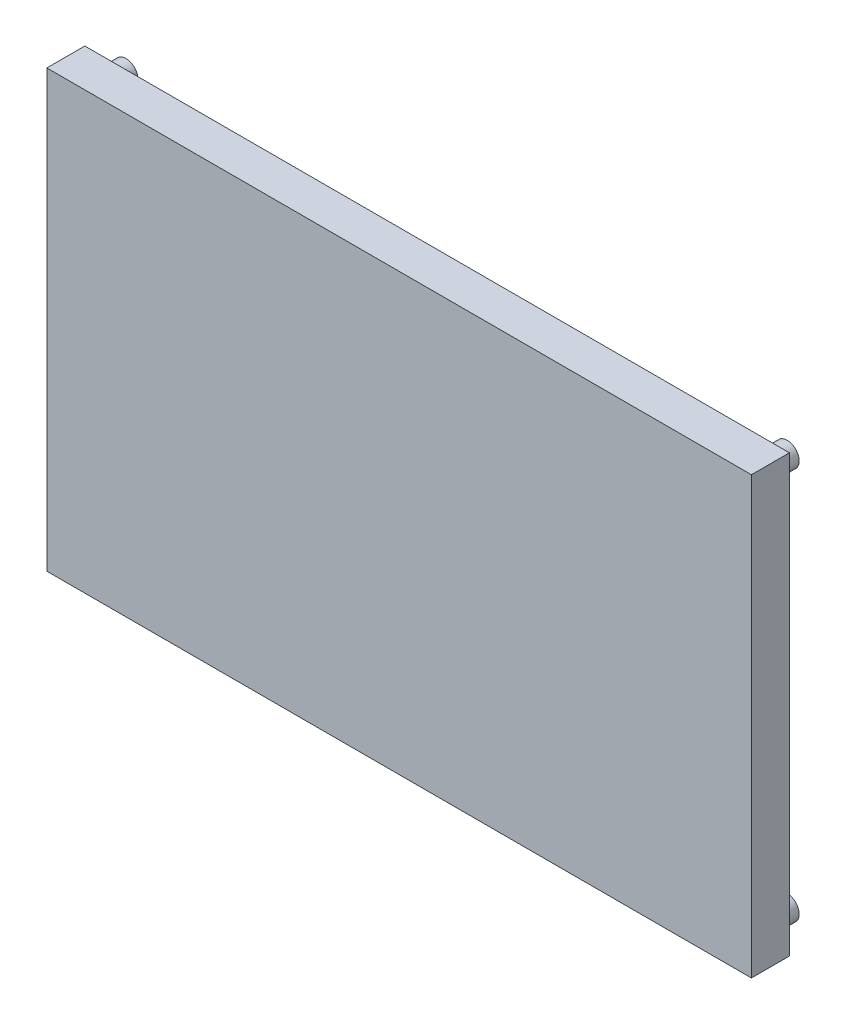
ISO-10303-21;
HEADER;
FILE_DESCRIPTION(('STEP AP214'),'2;1');
FILE_NAME('part.step','',(''),(''),'','','');
FILE_SCHEMA(('AUTOMOTIVE_DESIGN { 1 0 10303 214 1 1 1 1 }'));
ENDSEC;
DATA;
#1=APPLICATION_CONTEXT('core data for automotive mechanical design processes');
#2=APPLICATION_PROTOCOL_DEFINITION('international standard','automotive_design',2000,#1);
#3=PRODUCT_CONTEXT('',#1,'mechanical');
#4=PRODUCT('Part','Part','',(#3));
#5=PRODUCT_RELATED_PRODUCT_CATEGORY('part','',(#4));
#6=PRODUCT_DEFINITION_FORMATION('','',#4);
#7=PRODUCT_DEFINITION_CONTEXT('part definition',#1,'design');
#8=PRODUCT_DEFINITION('design','',#6,#7);
#9=PRODUCT_DEFINITION_SHAPE('','',#8);
#10=(LENGTH_UNIT() NAMED_UNIT(*) SI_UNIT(.MILLI.,.METRE.));
#11=(NAMED_UNIT(*) PLANE_ANGLE_UNIT() SI_UNIT($,.RADIAN.));
#12=(NAMED_UNIT(*) SI_UNIT($,.STERADIAN.) SOLID_ANGLE_UNIT());
#13=UNCERTAINTY_MEASURE_WITH_UNIT(LENGTH_MEASURE(1.E-05),#10,'distance_accuracy_value','');
#14=(GEOMETRIC_REPRESENTATION_CONTEXT(3) GLOBAL_UNCERTAINTY_ASSIGNED_CONTEXT((#13)) GLOBAL_UNIT_ASSIGNED_CONTEXT((#10,
#11,#12)) REPRESENTATION_CONTEXT('',''));
#15=CARTESIAN_POINT('',(0.,0.,0.));
#16=DIRECTION('',(0.,0.,1.));
#17=DIRECTION('',(1.,0.,0.));
#18=AXIS2_PLACEMENT_3D('',#15,#16,#17);
#19=CARTESIAN_POINT('',(-82.445,-51.,-8.89));
#20=DIRECTION('',(-1.,0.,0.));
#21=DIRECTION('',(0.,0.,1.));
#22=AXIS2_PLACEMENT_3D('',#19,#20,#21);
#23=PLANE('',#22);
#24=DIRECTION('',(0.,-1.,0.));
#25=VECTOR('',#24,1.);
#26=CARTESIAN_POINT('',(-82.445,-51.,0.));
#27=LINE('',#26,#25);
#28=CARTESIAN_POINT('',(-82.445,51.,0.));
#29=VERTEX_POINT('',#28);
#30=CARTESIAN_POINT('',(-82.445,-51.,0.));
#31=VERTEX_POINT('',#30);
#32=EDGE_CURVE('E119',#29,#31,#27,.T.);
#33=ORIENTED_EDGE('',*,*,#32,.F.);
#34=DIRECTION('',(0.,0.,1.));
#35=VECTOR('',#34,1.);
#36=CARTESIAN_POINT('',(-82.445,51.,-8.89));
#37=LINE('',#36,#35);
#38=CARTESIAN_POINT('',(-82.445,51.,-8.89));
#39=VERTEX_POINT('',#38);
#40=EDGE_CURVE('E62',#39,#29,#37,.T.);
#41=ORIENTED_EDGE('',*,*,#40,.F.);
#42=DIRECTION('',(0.,-1.,0.));
#43=VECTOR('',#42,1.);
#44=CARTESIAN_POINT('',(-82.445,-51.,-8.89));
#45=LINE('',#44,#43);
#46=CARTESIAN_POINT('',(-82.445,-51.,-8.89));
#47=VERTEX_POINT('',#46);
#48=EDGE_CURVE('E110',#39,#47,#45,.T.);
#49=ORIENTED_EDGE('',*,*,#48,.T.);
#50=DIRECTION('',(0.,0.,1.));
#51=VECTOR('',#50,1.);
#52=CARTESIAN_POINT('',(-82.445,-51.,-8.89));
#53=LINE('',#52,#51);
#54=EDGE_CURVE('E90',#47,#31,#53,.T.);
#55=ORIENTED_EDGE('',*,*,#54,.T.);
#56=EDGE_LOOP('',(#33,#41,#49,#55));
#57=FACE_BOUND('',#56,.T.);
#58=ADVANCED_FACE('F45',(#57),#23,.T.);
#59=CARTESIAN_POINT('',(82.445,51.,-8.89));
#60=DIRECTION('',(0.,1.,0.));
#61=DIRECTION('',(-1.,0.,0.));
#62=AXIS2_PLACEMENT_3D('',#59,#60,#61);
#63=PLANE('',#62);
#64=DIRECTION('',(-1.,0.,0.));
#65=VECTOR('',#64,1.);
#66=CARTESIAN_POINT('',(82.445,51.,0.));
#67=LINE('',#66,#65);
#68=CARTESIAN_POINT('',(82.445,51.,0.));
#69=VERTEX_POINT('',#68);
#70=EDGE_CURVE('E113',#69,#29,#67,.T.);
#71=ORIENTED_EDGE('',*,*,#70,.F.);
#72=DIRECTION('',(0.,0.,1.));
#73=VECTOR('',#72,1.);
#74=CARTESIAN_POINT('',(82.445,51.,-8.89));
#75=LINE('',#74,#73);
#76=CARTESIAN_POINT('',(82.445,51.,-8.89));
#77=VERTEX_POINT('',#76);
#78=EDGE_CURVE('E79',#77,#69,#75,.T.);
#79=ORIENTED_EDGE('',*,*,#78,.F.);
#80=DIRECTION('',(-1.,0.,0.));
#81=VECTOR('',#80,1.);
#82=CARTESIAN_POINT('',(82.445,51.,-8.89));
#83=LINE('',#82,#81);
#84=EDGE_CURVE('E105',#77,#39,#83,.T.);
#85=ORIENTED_EDGE('',*,*,#84,.T.);
#86=ORIENTED_EDGE('',*,*,#40,.T.);
#87=EDGE_LOOP('',(#71,#79,#85,#86));
#88=FACE_BOUND('',#87,.T.);
#89=ADVANCED_FACE('F200',(#88),#63,.T.);
#90=CARTESIAN_POINT('',(82.445,-51.,-8.89));
#91=DIRECTION('',(1.,0.,0.));
#92=DIRECTION('',(0.,0.,-1.));
#93=AXIS2_PLACEMENT_3D('',#90,#91,#92);
#94=PLANE('',#93);
#95=DIRECTION('',(0.,1.,0.));
#96=VECTOR('',#95,1.);
#97=CARTESIAN_POINT('',(82.445,-51.,0.));
#98=LINE('',#97,#96);
#99=CARTESIAN_POINT('',(82.445,-51.,0.));
#100=VERTEX_POINT('',#99);
#101=EDGE_CURVE('E98',#100,#69,#98,.T.);
#102=ORIENTED_EDGE('',*,*,#101,.F.);
#103=DIRECTION('',(0.,0.,1.));
#104=VECTOR('',#103,1.);
#105=CARTESIAN_POINT('',(82.445,-51.,-8.89));
#106=LINE('',#105,#104);
#107=CARTESIAN_POINT('',(82.445,-51.,-8.89));
#108=VERTEX_POINT('',#107);
#109=EDGE_CURVE('E93',#108,#100,#106,.T.);
#110=ORIENTED_EDGE('',*,*,#109,.F.);
#111=DIRECTION('',(0.,1.,0.));
#112=VECTOR('',#111,1.);
#113=CARTESIAN_POINT('',(82.445,-51.,-8.89));
#114=LINE('',#113,#112);
#115=EDGE_CURVE('E96',#108,#77,#114,.T.);
#116=ORIENTED_EDGE('',*,*,#115,.T.);
#117=ORIENTED_EDGE('',*,*,#78,.T.);
#118=EDGE_LOOP('',(#102,#110,#116,#117));
#119=FACE_BOUND('',#118,.T.);
#120=ADVANCED_FACE('F95',(#119),#94,.T.);
#121=CARTESIAN_POINT('',(82.445,-51.,-8.89));
#122=DIRECTION('',(0.,-1.,0.));
#123=DIRECTION('',(1.,0.,0.));
#124=AXIS2_PLACEMENT_3D('',#121,#122,#123);
#125=PLANE('',#124);
#126=DIRECTION('',(1.,0.,0.));
#127=VECTOR('',#126,1.);
#128=CARTESIAN_POINT('',(82.445,-51.,0.));
#129=LINE('',#128,#127);
#130=EDGE_CURVE('E123',#31,#100,#129,.T.);
#131=ORIENTED_EDGE('',*,*,#130,.F.);
#132=ORIENTED_EDGE('',*,*,#54,.F.);
#133=DIRECTION('',(1.,0.,0.));
#134=VECTOR('',#133,1.);
#135=CARTESIAN_POINT('',(82.445,-51.,-8.89));
#136=LINE('',#135,#134);
#137=EDGE_CURVE('E104',#47,#108,#136,.T.);
#138=ORIENTED_EDGE('',*,*,#137,.T.);
#139=ORIENTED_EDGE('',*,*,#109,.T.);
#140=EDGE_LOOP('',(#131,#132,#138,#139));
#141=FACE_BOUND('',#140,.T.);
#142=ADVANCED_FACE('F108',(#141),#125,.T.);
#143=CARTESIAN_POINT('',(0.,0.,-8.89));
#144=DIRECTION('',(0.,0.,1.));
#145=DIRECTION('',(1.,0.,0.));
#146=AXIS2_PLACEMENT_3D('',#143,#144,#145);
#147=PLANE('',#146);
#148=CARTESIAN_POINT('',(-23.351,15.78,-8.89));
#149=DIRECTION('',(0.,0.,1.));
#150=DIRECTION('',(1.,0.,0.));
#151=AXIS2_PLACEMENT_3D('',#148,#149,#150);
#152=CIRCLE('',#151,2.794);
#153=CARTESIAN_POINT('',(-20.557,15.78,-8.89));
#154=VERTEX_POINT('',#153);
#155=EDGE_CURVE('E11',#154,#154,#152,.F.);
#156=ORIENTED_EDGE('',*,*,#155,.F.);
#157=EDGE_LOOP('',(#156));
#158=FACE_BOUND('',#157,.T.);
#159=CARTESIAN_POINT('',(-23.351,-33.22,-8.89));
#160=DIRECTION('',(0.,0.,1.));
#161=DIRECTION('',(1.,0.,0.));
#162=AXIS2_PLACEMENT_3D('',#159,#160,#161);
#163=CIRCLE('',#162,2.794);
#164=CARTESIAN_POINT('',(-20.557,-33.22,-8.89));
#165=VERTEX_POINT('',#164);
#166=EDGE_CURVE('E54',#165,#165,#163,.F.);
#167=ORIENTED_EDGE('',*,*,#166,.F.);
#168=EDGE_LOOP('',(#167));
#169=FACE_BOUND('',#168,.T.);
#170=CARTESIAN_POINT('',(21.7389999999999,-33.22,-8.89));
#171=DIRECTION('',(0.,0.,1.));
#172=DIRECTION('',(1.,0.,0.));
#173=AXIS2_PLACEMENT_3D('',#170,#171,#172);
#174=CIRCLE('',#173,2.794);
#175=CARTESIAN_POINT('',(24.5329999999999,-33.22,-8.89));
#176=VERTEX_POINT('',#175);
#177=EDGE_CURVE('E158',#176,#176,#174,.F.);
#178=ORIENTED_EDGE('',*,*,#177,.F.);
#179=EDGE_LOOP('',(#178));
#180=FACE_BOUND('',#179,.T.);
#181=CARTESIAN_POINT('',(21.739,15.78,-8.89));
#182=DIRECTION('',(0.,0.,1.));
#183=DIRECTION('',(1.,0.,0.));
#184=AXIS2_PLACEMENT_3D('',#181,#182,#183);
#185=CIRCLE('',#184,2.794);
#186=CARTESIAN_POINT('',(24.533,15.78,-8.89));
#187=VERTEX_POINT('',#186);
#188=EDGE_CURVE('E154',#187,#187,#185,.F.);
#189=ORIENTED_EDGE('',*,*,#188,.F.);
#190=EDGE_LOOP('',(#189));
#191=FACE_BOUND('',#190,.T.);
#192=CARTESIAN_POINT('',(-77.365,45.92,-8.89));
#193=DIRECTION('',(0.,0.,1.));
#194=DIRECTION('',(1.,0.,0.));
#195=AXIS2_PLACEMENT_3D('',#192,#193,#194);
#196=CIRCLE('',#195,2.79400000000001);
#197=CARTESIAN_POINT('',(-74.571,45.92,-8.89));
#198=VERTEX_POINT('',#197);
#199=EDGE_CURVE('E150',#198,#198,#196,.F.);
#200=ORIENTED_EDGE('',*,*,#199,.F.);
#201=EDGE_LOOP('',(#200));
#202=FACE_BOUND('',#201,.T.);
#203=CARTESIAN_POINT('',(77.365,-45.92,-8.89));
#204=DIRECTION('',(0.,0.,1.));
#205=DIRECTION('',(1.,0.,0.));
#206=AXIS2_PLACEMENT_3D('',#203,#204,#205);
#207=CIRCLE('',#206,2.79400000000001);
#208=CARTESIAN_POINT('',(80.1589999999999,-45.92,-8.89));
#209=VERTEX_POINT('',#208);
#210=EDGE_CURVE('E146',#209,#209,#207,.F.);
#211=ORIENTED_EDGE('',*,*,#210,.F.);
#212=EDGE_LOOP('',(#211));
#213=FACE_BOUND('',#212,.T.);
#214=CARTESIAN_POINT('',(-77.365,-45.92,-8.89));
#215=DIRECTION('',(0.,0.,1.));
#216=DIRECTION('',(1.,0.,0.));
#217=AXIS2_PLACEMENT_3D('',#214,#215,#216);
#218=CIRCLE('',#217,2.79400000000001);
#219=CARTESIAN_POINT('',(-74.571,-45.92,-8.89));
#220=VERTEX_POINT('',#219);
#221=EDGE_CURVE('E142',#220,#220,#218,.F.);
#222=ORIENTED_EDGE('',*,*,#221,.F.);
#223=EDGE_LOOP('',(#222));
#224=FACE_BOUND('',#223,.T.);
#225=CARTESIAN_POINT('',(77.365,45.92,-8.89));
#226=DIRECTION('',(0.,0.,1.));
#227=DIRECTION('',(1.,0.,0.));
#228=AXIS2_PLACEMENT_3D('',#225,#226,#227);
#229=CIRCLE('',#228,2.79400000000001);
#230=CARTESIAN_POINT('',(80.159,45.92,-8.89));
#231=VERTEX_POINT('',#230);
#232=EDGE_CURVE('E134',#231,#231,#229,.F.);
#233=ORIENTED_EDGE('',*,*,#232,.F.);
#234=EDGE_LOOP('',(#233));
#235=FACE_BOUND('',#234,.T.);
#236=ORIENTED_EDGE('',*,*,#48,.F.);
#237=ORIENTED_EDGE('',*,*,#84,.F.);
#238=ORIENTED_EDGE('',*,*,#115,.F.);
#239=ORIENTED_EDGE('',*,*,#137,.F.);
#240=EDGE_LOOP('',(#236,#237,#238,#239));
#241=FACE_BOUND('',#240,.T.);
#242=ADVANCED_FACE('F103',(#158,#169,#180,#191,#202,#213,#224,#235,#241),#147,.F.);
#243=CARTESIAN_POINT('',(0.,0.,0.));
#244=DIRECTION('',(0.,0.,1.));
#245=DIRECTION('',(1.,0.,0.));
#246=AXIS2_PLACEMENT_3D('',#243,#244,#245);
#247=PLANE('',#246);
#248=ORIENTED_EDGE('',*,*,#32,.T.);
#249=ORIENTED_EDGE('',*,*,#130,.T.);
#250=ORIENTED_EDGE('',*,*,#101,.T.);
#251=ORIENTED_EDGE('',*,*,#70,.T.);
#252=EDGE_LOOP('',(#248,#249,#250,#251));
#253=FACE_BOUND('',#252,.T.);
#254=ADVANCED_FACE('F169',(#253),#247,.T.);
#255=CARTESIAN_POINT('',(77.365,45.92,-13.462));
#256=DIRECTION('',(0.,0.,1.));
#257=DIRECTION('',(1.,0.,0.));
#258=AXIS2_PLACEMENT_3D('',#255,#256,#257);
#259=CYLINDRICAL_SURFACE('',#258,2.79400000000001);
#260=CARTESIAN_POINT('',(77.365,45.92,-13.462));
#261=DIRECTION('',(0.,0.,-1.));
#262=DIRECTION('',(-1.,0.,0.));
#263=AXIS2_PLACEMENT_3D('',#260,#261,#262);
#264=CIRCLE('',#263,2.79400000000001);
#265=CARTESIAN_POINT('',(74.571,45.92,-13.462));
#266=VERTEX_POINT('',#265);
#267=EDGE_CURVE('E124',#266,#266,#264,.T.);
#268=ORIENTED_EDGE('',*,*,#267,.F.);
#269=EDGE_LOOP('',(#268));
#270=FACE_BOUND('',#269,.T.);
#271=ORIENTED_EDGE('',*,*,#232,.T.);
#272=EDGE_LOOP('',(#271));
#273=FACE_BOUND('',#272,.T.);
#274=ADVANCED_FACE('F184',(#270,#273),#259,.T.);
#275=CARTESIAN_POINT('',(77.365,45.92,-13.462));
#276=DIRECTION('',(0.,0.,-1.));
#277=DIRECTION('',(-1.,0.,0.));
#278=AXIS2_PLACEMENT_3D('',#275,#276,#277);
#279=PLANE('',#278);
#280=ORIENTED_EDGE('',*,*,#267,.T.);
#281=EDGE_LOOP('',(#280));
#282=FACE_BOUND('',#281,.T.);
#283=ADVANCED_FACE('F186',(#282),#279,.T.);
#284=CARTESIAN_POINT('',(-77.365,-45.92,-13.462));
#285=DIRECTION('',(0.,0.,1.));
#286=DIRECTION('',(1.,0.,0.));
#287=AXIS2_PLACEMENT_3D('',#284,#285,#286);
#288=CYLINDRICAL_SURFACE('',#287,2.79400000000001);
#289=CARTESIAN_POINT('',(-77.365,-45.92,-13.462));
#290=DIRECTION('',(0.,0.,-1.));
#291=DIRECTION('',(-1.,0.,0.));
#292=AXIS2_PLACEMENT_3D('',#289,#290,#291);
#293=CIRCLE('',#292,2.79400000000001);
#294=CARTESIAN_POINT('',(-80.159,-45.92,-13.462));
#295=VERTEX_POINT('',#294);
#296=EDGE_CURVE('E391',#295,#295,#293,.T.);
#297=ORIENTED_EDGE('',*,*,#296,.F.);
#298=EDGE_LOOP('',(#297));
#299=FACE_BOUND('',#298,.T.);
#300=ORIENTED_EDGE('',*,*,#221,.T.);
#301=EDGE_LOOP('',(#300));
#302=FACE_BOUND('',#301,.T.);
#303=ADVANCED_FACE('F193',(#299,#302),#288,.T.);
#304=CARTESIAN_POINT('',(-77.365,-45.92,-13.462));
#305=DIRECTION('',(0.,0.,-1.));
#306=DIRECTION('',(-1.,0.,0.));
#307=AXIS2_PLACEMENT_3D('',#304,#305,#306);
#308=PLANE('',#307);
#309=ORIENTED_EDGE('',*,*,#296,.T.);
#310=EDGE_LOOP('',(#309));
#311=FACE_BOUND('',#310,.T.);
#312=ADVANCED_FACE('F243',(#311),#308,.T.);
#313=CARTESIAN_POINT('',(77.365,-45.92,-13.462));
#314=DIRECTION('',(0.,0.,1.));
#315=DIRECTION('',(1.,0.,0.));
#316=AXIS2_PLACEMENT_3D('',#313,#314,#315);
#317=CYLINDRICAL_SURFACE('',#316,2.79400000000001);
#318=CARTESIAN_POINT('',(77.365,-45.92,-13.462));
#319=DIRECTION('',(0.,0.,-1.));
#320=DIRECTION('',(-1.,0.,0.));
#321=AXIS2_PLACEMENT_3D('',#318,#319,#320);
#322=CIRCLE('',#321,2.79400000000001);
#323=CARTESIAN_POINT('',(74.5709999999999,-45.92,-13.462));
#324=VERTEX_POINT('',#323);
#325=EDGE_CURVE('E395',#324,#324,#322,.T.);
#326=ORIENTED_EDGE('',*,*,#325,.F.);
#327=EDGE_LOOP('',(#326));
#328=FACE_BOUND('',#327,.T.);
#329=ORIENTED_EDGE('',*,*,#210,.T.);
#330=EDGE_LOOP('',(#329));
#331=FACE_BOUND('',#330,.T.);
#332=ADVANCED_FACE('F253',(#328,#331),#317,.T.);
#333=CARTESIAN_POINT('',(77.365,-45.92,-13.462));
#334=DIRECTION('',(0.,0.,-1.));
#335=DIRECTION('',(-1.,0.,0.));
#336=AXIS2_PLACEMENT_3D('',#333,#334,#335);
#337=PLANE('',#336);
#338=ORIENTED_EDGE('',*,*,#325,.T.);
#339=EDGE_LOOP('',(#338));
#340=FACE_BOUND('',#339,.T.);
#341=ADVANCED_FACE('F263',(#340),#337,.T.);
#342=CARTESIAN_POINT('',(-77.365,45.92,-13.462));
#343=DIRECTION('',(0.,0.,1.));
#344=DIRECTION('',(1.,0.,0.));
#345=AXIS2_PLACEMENT_3D('',#342,#343,#344);
#346=CYLINDRICAL_SURFACE('',#345,2.79400000000001);
#347=CARTESIAN_POINT('',(-77.365,45.92,-13.462));
#348=DIRECTION('',(0.,0.,-1.));
#349=DIRECTION('',(-1.,0.,0.));
#350=AXIS2_PLACEMENT_3D('',#347,#348,#349);
#351=CIRCLE('',#350,2.79400000000001);
#352=CARTESIAN_POINT('',(-80.159,45.92,-13.462));
#353=VERTEX_POINT('',#352);
#354=EDGE_CURVE('E396',#353,#353,#351,.T.);
#355=ORIENTED_EDGE('',*,*,#354,.F.);
#356=EDGE_LOOP('',(#355));
#357=FACE_BOUND('',#356,.T.);
#358=ORIENTED_EDGE('',*,*,#199,.T.);
#359=EDGE_LOOP('',(#358));
#360=FACE_BOUND('',#359,.T.);
#361=ADVANCED_FACE('F273',(#357,#360),#346,.T.);
#362=CARTESIAN_POINT('',(-77.365,45.92,-13.462));
#363=DIRECTION('',(0.,0.,-1.));
#364=DIRECTION('',(-1.,0.,0.));
#365=AXIS2_PLACEMENT_3D('',#362,#363,#364);
#366=PLANE('',#365);
#367=ORIENTED_EDGE('',*,*,#354,.T.);
#368=EDGE_LOOP('',(#367));
#369=FACE_BOUND('',#368,.T.);
#370=ADVANCED_FACE('F283',(#369),#366,.T.);
#371=CARTESIAN_POINT('',(21.739,15.78,-14.478));
#372=DIRECTION('',(0.,0.,1.));
#373=DIRECTION('',(1.,0.,0.));
#374=AXIS2_PLACEMENT_3D('',#371,#372,#373);
#375=CYLINDRICAL_SURFACE('',#374,2.794);
#376=CARTESIAN_POINT('',(21.739,15.78,-14.478));
#377=DIRECTION('',(0.,0.,-1.));
#378=DIRECTION('',(-1.,0.,0.));
#379=AXIS2_PLACEMENT_3D('',#376,#377,#378);
#380=CIRCLE('',#379,2.794);
#381=CARTESIAN_POINT('',(18.945,15.78,-14.478));
#382=VERTEX_POINT('',#381);
#383=EDGE_CURVE('E387',#382,#382,#380,.T.);
#384=ORIENTED_EDGE('',*,*,#383,.F.);
#385=EDGE_LOOP('',(#384));
#386=FACE_BOUND('',#385,.T.);
#387=ORIENTED_EDGE('',*,*,#188,.T.);
#388=EDGE_LOOP('',(#387));
#389=FACE_BOUND('',#388,.T.);
#390=ADVANCED_FACE('F293',(#386,#389),#375,.T.);
#391=CARTESIAN_POINT('',(21.739,15.78,-14.478));
#392=DIRECTION('',(0.,0.,-1.));
#393=DIRECTION('',(-1.,0.,0.));
#394=AXIS2_PLACEMENT_3D('',#391,#392,#393);
#395=PLANE('',#394);
#396=ORIENTED_EDGE('',*,*,#383,.T.);
#397=EDGE_LOOP('',(#396));
#398=FACE_BOUND('',#397,.T.);
#399=ADVANCED_FACE('F303',(#398),#395,.T.);
#400=CARTESIAN_POINT('',(21.7389999999999,-33.22,-14.478));
#401=DIRECTION('',(0.,0.,1.));
#402=DIRECTION('',(1.,0.,0.));
#403=AXIS2_PLACEMENT_3D('',#400,#401,#402);
#404=CYLINDRICAL_SURFACE('',#403,2.794);
#405=CARTESIAN_POINT('',(21.7389999999999,-33.22,-14.478));
#406=DIRECTION('',(0.,0.,-1.));
#407=DIRECTION('',(-1.,0.,0.));
#408=AXIS2_PLACEMENT_3D('',#405,#406,#407);
#409=CIRCLE('',#408,2.794);
#410=CARTESIAN_POINT('',(18.9449999999999,-33.22,-14.478));
#411=VERTEX_POINT('',#410);
#412=EDGE_CURVE('E383',#411,#411,#409,.T.);
#413=ORIENTED_EDGE('',*,*,#412,.F.);
#414=EDGE_LOOP('',(#413));
#415=FACE_BOUND('',#414,.T.);
#416=ORIENTED_EDGE('',*,*,#177,.T.);
#417=EDGE_LOOP('',(#416));
#418=FACE_BOUND('',#417,.T.);
#419=ADVANCED_FACE('F313',(#415,#418),#404,.T.);
#420=CARTESIAN_POINT('',(21.7389999999999,-33.22,-14.478));
#421=DIRECTION('',(0.,0.,-1.));
#422=DIRECTION('',(-1.,0.,0.));
#423=AXIS2_PLACEMENT_3D('',#420,#421,#422);
#424=PLANE('',#423);
#425=ORIENTED_EDGE('',*,*,#412,.T.);
#426=EDGE_LOOP('',(#425));
#427=FACE_BOUND('',#426,.T.);
#428=ADVANCED_FACE('F323',(#427),#424,.T.);
#429=CARTESIAN_POINT('',(-23.351,-33.22,-14.478));
#430=DIRECTION('',(0.,0.,1.));
#431=DIRECTION('',(1.,0.,0.));
#432=AXIS2_PLACEMENT_3D('',#429,#430,#431);
#433=CYLINDRICAL_SURFACE('',#432,2.794);
#434=CARTESIAN_POINT('',(-23.351,-33.22,-14.478));
#435=DIRECTION('',(0.,0.,-1.));
#436=DIRECTION('',(-1.,0.,0.));
#437=AXIS2_PLACEMENT_3D('',#434,#435,#436);
#438=CIRCLE('',#437,2.794);
#439=CARTESIAN_POINT('',(-26.145,-33.22,-14.478));
#440=VERTEX_POINT('',#439);
#441=EDGE_CURVE('E379',#440,#440,#438,.T.);
#442=ORIENTED_EDGE('',*,*,#441,.F.);
#443=EDGE_LOOP('',(#442));
#444=FACE_BOUND('',#443,.T.);
#445=ORIENTED_EDGE('',*,*,#166,.T.);
#446=EDGE_LOOP('',(#445));
#447=FACE_BOUND('',#446,.T.);
#448=ADVANCED_FACE('F165',(#444,#447),#433,.T.);
#449=CARTESIAN_POINT('',(-23.351,-33.22,-14.478));
#450=DIRECTION('',(0.,0.,-1.));
#451=DIRECTION('',(-1.,0.,0.));
#452=AXIS2_PLACEMENT_3D('',#449,#450,#451);
#453=PLANE('',#452);
#454=ORIENTED_EDGE('',*,*,#441,.T.);
#455=EDGE_LOOP('',(#454));
#456=FACE_BOUND('',#455,.T.);
#457=ADVANCED_FACE('F342',(#456),#453,.T.);
#458=CARTESIAN_POINT('',(-23.351,15.78,-14.478));
#459=DIRECTION('',(0.,0.,1.));
#460=DIRECTION('',(1.,0.,0.));
#461=AXIS2_PLACEMENT_3D('',#458,#459,#460);
#462=CYLINDRICAL_SURFACE('',#461,2.794);
#463=CARTESIAN_POINT('',(-23.351,15.78,-14.478));
#464=DIRECTION('',(0.,0.,-1.));
#465=DIRECTION('',(-1.,0.,0.));
#466=AXIS2_PLACEMENT_3D('',#463,#464,#465);
#467=CIRCLE('',#466,2.794);
#468=CARTESIAN_POINT('',(-26.145,15.78,-14.478));
#469=VERTEX_POINT('',#468);
#470=EDGE_CURVE('E377',#469,#469,#467,.T.);
#471=ORIENTED_EDGE('',*,*,#470,.F.);
#472=EDGE_LOOP('',(#471));
#473=FACE_BOUND('',#472,.T.);
#474=ORIENTED_EDGE('',*,*,#155,.T.);
#475=EDGE_LOOP('',(#474));
#476=FACE_BOUND('',#475,.T.);
#477=ADVANCED_FACE('F352',(#473,#476),#462,.T.);
#478=CARTESIAN_POINT('',(-23.351,15.78,-14.478));
#479=DIRECTION('',(0.,0.,-1.));
#480=DIRECTION('',(-1.,0.,0.));
#481=AXIS2_PLACEMENT_3D('',#478,#479,#480);
#482=PLANE('',#481);
#483=ORIENTED_EDGE('',*,*,#470,.T.);
#484=EDGE_LOOP('',(#483));
#485=FACE_BOUND('',#484,.T.);
#486=ADVANCED_FACE('F362',(#485),#482,.T.);
#487=CLOSED_SHELL('',(#58,#89,#120,#142,#242,#254,#274,#283,#303,#312,#332,#341,#361,#370,#390,
#399,#419,#428,#448,#457,#477,#486));
#488=MANIFOLD_SOLID_BREP('B2',#487);
#489=ADVANCED_BREP_SHAPE_REPRESENTATION('',(#18,#488),#14);
#490=SHAPE_DEFINITION_REPRESENTATION(#9,#489);
ENDSEC;
END-ISO-10303-21;
